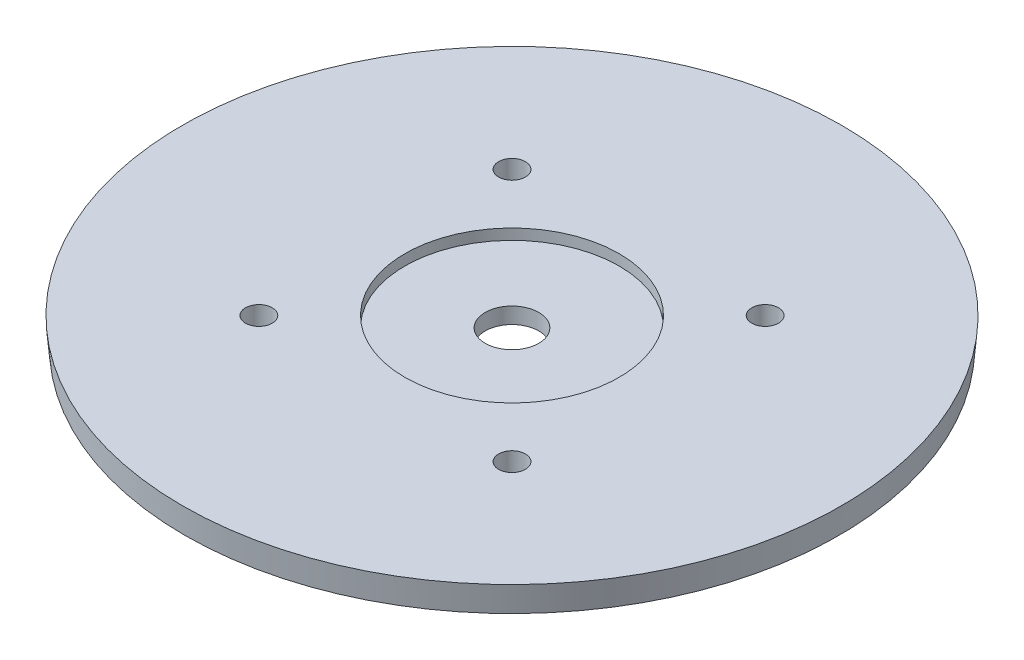
ISO-10303-21;
HEADER;
FILE_DESCRIPTION(('STEP AP214'),'2;1');
FILE_NAME('part.step','',(''),(''),'','','');
FILE_SCHEMA(('AUTOMOTIVE_DESIGN { 1 0 10303 214 1 1 1 1 }'));
ENDSEC;
DATA;
#1=APPLICATION_CONTEXT('core data for automotive mechanical design processes');
#2=APPLICATION_PROTOCOL_DEFINITION('international standard','automotive_design',2000,#1);
#3=PRODUCT_CONTEXT('',#1,'mechanical');
#4=PRODUCT('Part','Part','',(#3));
#5=PRODUCT_RELATED_PRODUCT_CATEGORY('part','',(#4));
#6=PRODUCT_DEFINITION_FORMATION('','',#4);
#7=PRODUCT_DEFINITION_CONTEXT('part definition',#1,'design');
#8=PRODUCT_DEFINITION('design','',#6,#7);
#9=PRODUCT_DEFINITION_SHAPE('','',#8);
#10=(LENGTH_UNIT() NAMED_UNIT(*) SI_UNIT(.MILLI.,.METRE.));
#11=(NAMED_UNIT(*) PLANE_ANGLE_UNIT() SI_UNIT($,.RADIAN.));
#12=(NAMED_UNIT(*) SI_UNIT($,.STERADIAN.) SOLID_ANGLE_UNIT());
#13=UNCERTAINTY_MEASURE_WITH_UNIT(LENGTH_MEASURE(1.E-05),#10,'distance_accuracy_value','');
#14=(GEOMETRIC_REPRESENTATION_CONTEXT(3) GLOBAL_UNCERTAINTY_ASSIGNED_CONTEXT((#13)) GLOBAL_UNIT_ASSIGNED_CONTEXT((#10,
#11,#12)) REPRESENTATION_CONTEXT('',''));
#15=CARTESIAN_POINT('',(0.,0.,0.));
#16=DIRECTION('',(0.,0.,1.));
#17=DIRECTION('',(1.,0.,0.));
#18=AXIS2_PLACEMENT_3D('',#15,#16,#17);
#19=CARTESIAN_POINT('',(0.,-5.,0.));
#20=DIRECTION('',(0.,1.,0.));
#21=DIRECTION('',(0.,0.,1.));
#22=AXIS2_PLACEMENT_3D('',#19,#20,#21);
#23=CYLINDRICAL_SURFACE('',#22,5.);
#24=CARTESIAN_POINT('',(0.,-5.,0.));
#25=DIRECTION('',(0.,1.,0.));
#26=DIRECTION('',(0.,0.,1.));
#27=AXIS2_PLACEMENT_3D('',#24,#25,#26);
#28=CIRCLE('',#27,5.);
#29=CARTESIAN_POINT('',(0.,-5.,4.99999999999999));
#30=VERTEX_POINT('',#29);
#31=EDGE_CURVE('E62',#30,#30,#28,.T.);
#32=ORIENTED_EDGE('',*,*,#31,.F.);
#33=EDGE_LOOP('',(#32));
#34=FACE_BOUND('',#33,.T.);
#35=CARTESIAN_POINT('',(0.,-2.,0.));
#36=DIRECTION('',(0.,1.,0.));
#37=DIRECTION('',(0.,0.,1.));
#38=AXIS2_PLACEMENT_3D('',#35,#36,#37);
#39=CIRCLE('',#38,5.);
#40=CARTESIAN_POINT('',(0.,-2.,4.99999999999999));
#41=VERTEX_POINT('',#40);
#42=EDGE_CURVE('E41',#41,#41,#39,.F.);
#43=ORIENTED_EDGE('',*,*,#42,.F.);
#44=EDGE_LOOP('',(#43));
#45=FACE_BOUND('',#44,.T.);
#46=ADVANCED_FACE('F37',(#34,#45),#23,.F.);
#47=CARTESIAN_POINT('',(0.,0.,0.));
#48=DIRECTION('',(0.,1.,0.));
#49=DIRECTION('',(0.,0.,1.));
#50=AXIS2_PLACEMENT_3D('',#47,#48,#49);
#51=CONICAL_SURFACE('',#50,61.5,0.0872664625997165);
#52=CARTESIAN_POINT('',(0.,-5.,0.));
#53=DIRECTION('',(0.,1.,0.));
#54=DIRECTION('',(0.,0.,1.));
#55=AXIS2_PLACEMENT_3D('',#52,#53,#54);
#56=CIRCLE('',#55,61.0625566823704);
#57=CARTESIAN_POINT('',(0.,-5.,61.0625566823704));
#58=VERTEX_POINT('',#57);
#59=EDGE_CURVE('E10',#58,#58,#56,.T.);
#60=ORIENTED_EDGE('',*,*,#59,.T.);
#61=EDGE_LOOP('',(#60));
#62=FACE_BOUND('',#61,.T.);
#63=CARTESIAN_POINT('',(0.,0.,0.));
#64=DIRECTION('',(0.,1.,0.));
#65=DIRECTION('',(0.,0.,1.));
#66=AXIS2_PLACEMENT_3D('',#63,#64,#65);
#67=CIRCLE('',#66,61.5);
#68=CARTESIAN_POINT('',(0.,0.,61.5));
#69=VERTEX_POINT('',#68);
#70=EDGE_CURVE('E46',#69,#69,#67,.T.);
#71=ORIENTED_EDGE('',*,*,#70,.F.);
#72=EDGE_LOOP('',(#71));
#73=FACE_BOUND('',#72,.T.);
#74=ADVANCED_FACE('F39',(#62,#73),#51,.T.);
#75=CARTESIAN_POINT('',(0.,-5.,0.));
#76=DIRECTION('',(0.,1.,0.));
#77=DIRECTION('',(0.,0.,1.));
#78=AXIS2_PLACEMENT_3D('',#75,#76,#77);
#79=PLANE('',#78);
#80=ORIENTED_EDGE('',*,*,#31,.T.);
#81=EDGE_LOOP('',(#80));
#82=FACE_BOUND('',#81,.T.);
#83=CARTESIAN_POINT('',(-23.62,-5.,-23.62));
#84=DIRECTION('',(0.,1.,0.));
#85=DIRECTION('',(0.,0.,1.));
#86=AXIS2_PLACEMENT_3D('',#83,#84,#85);
#87=CIRCLE('',#86,2.5);
#88=CARTESIAN_POINT('',(-23.62,-5.,-21.12));
#89=VERTEX_POINT('',#88);
#90=EDGE_CURVE('E70',#89,#89,#87,.T.);
#91=ORIENTED_EDGE('',*,*,#90,.T.);
#92=EDGE_LOOP('',(#91));
#93=FACE_BOUND('',#92,.T.);
#94=CARTESIAN_POINT('',(-23.62,-5.,23.62));
#95=DIRECTION('',(0.,1.,0.));
#96=DIRECTION('',(0.,0.,1.));
#97=AXIS2_PLACEMENT_3D('',#94,#95,#96);
#98=CIRCLE('',#97,2.5);
#99=CARTESIAN_POINT('',(-23.62,-5.,26.12));
#100=VERTEX_POINT('',#99);
#101=EDGE_CURVE('E78',#100,#100,#98,.T.);
#102=ORIENTED_EDGE('',*,*,#101,.T.);
#103=EDGE_LOOP('',(#102));
#104=FACE_BOUND('',#103,.T.);
#105=CARTESIAN_POINT('',(23.62,-5.,23.62));
#106=DIRECTION('',(0.,1.,0.));
#107=DIRECTION('',(0.,0.,1.));
#108=AXIS2_PLACEMENT_3D('',#105,#106,#107);
#109=CIRCLE('',#108,2.5);
#110=CARTESIAN_POINT('',(23.62,-5.,26.12));
#111=VERTEX_POINT('',#110);
#112=EDGE_CURVE('E58',#111,#111,#109,.T.);
#113=ORIENTED_EDGE('',*,*,#112,.T.);
#114=EDGE_LOOP('',(#113));
#115=FACE_BOUND('',#114,.T.);
#116=CARTESIAN_POINT('',(23.62,-5.,-23.62));
#117=DIRECTION('',(0.,1.,0.));
#118=DIRECTION('',(0.,0.,1.));
#119=AXIS2_PLACEMENT_3D('',#116,#117,#118);
#120=CIRCLE('',#119,2.5);
#121=CARTESIAN_POINT('',(23.62,-5.,-21.12));
#122=VERTEX_POINT('',#121);
#123=EDGE_CURVE('E51',#122,#122,#120,.T.);
#124=ORIENTED_EDGE('',*,*,#123,.T.);
#125=EDGE_LOOP('',(#124));
#126=FACE_BOUND('',#125,.T.);
#127=ORIENTED_EDGE('',*,*,#59,.F.);
#128=EDGE_LOOP('',(#127));
#129=FACE_BOUND('',#128,.T.);
#130=ADVANCED_FACE('F110',(#82,#93,#104,#115,#126,#129),#79,.F.);
#131=CARTESIAN_POINT('',(0.,0.,0.));
#132=DIRECTION('',(0.,1.,0.));
#133=DIRECTION('',(0.,0.,1.));
#134=AXIS2_PLACEMENT_3D('',#131,#132,#133);
#135=PLANE('',#134);
#136=CARTESIAN_POINT('',(0.,0.,0.));
#137=DIRECTION('',(0.,1.,0.));
#138=DIRECTION('',(0.,0.,1.));
#139=AXIS2_PLACEMENT_3D('',#136,#137,#138);
#140=CIRCLE('',#139,20.);
#141=CARTESIAN_POINT('',(0.,0.,20.));
#142=VERTEX_POINT('',#141);
#143=EDGE_CURVE('E89',#142,#142,#140,.T.);
#144=ORIENTED_EDGE('',*,*,#143,.F.);
#145=EDGE_LOOP('',(#144));
#146=FACE_BOUND('',#145,.T.);
#147=CARTESIAN_POINT('',(-23.62,0.,-23.62));
#148=DIRECTION('',(0.,1.,0.));
#149=DIRECTION('',(0.,0.,1.));
#150=AXIS2_PLACEMENT_3D('',#147,#148,#149);
#151=CIRCLE('',#150,2.5);
#152=CARTESIAN_POINT('',(-23.62,0.,-21.12));
#153=VERTEX_POINT('',#152);
#154=EDGE_CURVE('E66',#153,#153,#151,.T.);
#155=ORIENTED_EDGE('',*,*,#154,.F.);
#156=EDGE_LOOP('',(#155));
#157=FACE_BOUND('',#156,.T.);
#158=CARTESIAN_POINT('',(-23.62,0.,23.62));
#159=DIRECTION('',(0.,1.,0.));
#160=DIRECTION('',(0.,0.,1.));
#161=AXIS2_PLACEMENT_3D('',#158,#159,#160);
#162=CIRCLE('',#161,2.5);
#163=CARTESIAN_POINT('',(-23.62,0.,26.12));
#164=VERTEX_POINT('',#163);
#165=EDGE_CURVE('E74',#164,#164,#162,.T.);
#166=ORIENTED_EDGE('',*,*,#165,.F.);
#167=EDGE_LOOP('',(#166));
#168=FACE_BOUND('',#167,.T.);
#169=CARTESIAN_POINT('',(23.62,0.,23.62));
#170=DIRECTION('',(0.,1.,0.));
#171=DIRECTION('',(0.,0.,1.));
#172=AXIS2_PLACEMENT_3D('',#169,#170,#171);
#173=CIRCLE('',#172,2.5);
#174=CARTESIAN_POINT('',(23.62,0.,26.12));
#175=VERTEX_POINT('',#174);
#176=EDGE_CURVE('E82',#175,#175,#173,.T.);
#177=ORIENTED_EDGE('',*,*,#176,.F.);
#178=EDGE_LOOP('',(#177));
#179=FACE_BOUND('',#178,.T.);
#180=CARTESIAN_POINT('',(23.62,0.,-23.62));
#181=DIRECTION('',(0.,1.,0.));
#182=DIRECTION('',(0.,0.,1.));
#183=AXIS2_PLACEMENT_3D('',#180,#181,#182);
#184=CIRCLE('',#183,2.5);
#185=CARTESIAN_POINT('',(23.62,0.,-21.12));
#186=VERTEX_POINT('',#185);
#187=EDGE_CURVE('E54',#186,#186,#184,.T.);
#188=ORIENTED_EDGE('',*,*,#187,.F.);
#189=EDGE_LOOP('',(#188));
#190=FACE_BOUND('',#189,.T.);
#191=ORIENTED_EDGE('',*,*,#70,.T.);
#192=EDGE_LOOP('',(#191));
#193=FACE_BOUND('',#192,.T.);
#194=ADVANCED_FACE('F120',(#146,#157,#168,#179,#190,#193),#135,.T.);
#195=CARTESIAN_POINT('',(23.62,-5.,-23.62));
#196=DIRECTION('',(0.,1.,0.));
#197=DIRECTION('',(0.,0.,1.));
#198=AXIS2_PLACEMENT_3D('',#195,#196,#197);
#199=CYLINDRICAL_SURFACE('',#198,2.5);
#200=ORIENTED_EDGE('',*,*,#123,.F.);
#201=EDGE_LOOP('',(#200));
#202=FACE_BOUND('',#201,.T.);
#203=ORIENTED_EDGE('',*,*,#187,.T.);
#204=EDGE_LOOP('',(#203));
#205=FACE_BOUND('',#204,.T.);
#206=ADVANCED_FACE('F116',(#202,#205),#199,.F.);
#207=CARTESIAN_POINT('',(23.62,-5.,23.62));
#208=DIRECTION('',(0.,1.,0.));
#209=DIRECTION('',(0.,0.,1.));
#210=AXIS2_PLACEMENT_3D('',#207,#208,#209);
#211=CYLINDRICAL_SURFACE('',#210,2.5);
#212=ORIENTED_EDGE('',*,*,#112,.F.);
#213=EDGE_LOOP('',(#212));
#214=FACE_BOUND('',#213,.T.);
#215=ORIENTED_EDGE('',*,*,#176,.T.);
#216=EDGE_LOOP('',(#215));
#217=FACE_BOUND('',#216,.T.);
#218=ADVANCED_FACE('F119',(#214,#217),#211,.F.);
#219=CARTESIAN_POINT('',(-23.62,-5.,23.62));
#220=DIRECTION('',(0.,1.,0.));
#221=DIRECTION('',(0.,0.,1.));
#222=AXIS2_PLACEMENT_3D('',#219,#220,#221);
#223=CYLINDRICAL_SURFACE('',#222,2.5);
#224=ORIENTED_EDGE('',*,*,#101,.F.);
#225=EDGE_LOOP('',(#224));
#226=FACE_BOUND('',#225,.T.);
#227=ORIENTED_EDGE('',*,*,#165,.T.);
#228=EDGE_LOOP('',(#227));
#229=FACE_BOUND('',#228,.T.);
#230=ADVANCED_FACE('F143',(#226,#229),#223,.F.);
#231=CARTESIAN_POINT('',(-23.62,-5.,-23.62));
#232=DIRECTION('',(0.,1.,0.));
#233=DIRECTION('',(0.,0.,1.));
#234=AXIS2_PLACEMENT_3D('',#231,#232,#233);
#235=CYLINDRICAL_SURFACE('',#234,2.5);
#236=ORIENTED_EDGE('',*,*,#90,.F.);
#237=EDGE_LOOP('',(#236));
#238=FACE_BOUND('',#237,.T.);
#239=ORIENTED_EDGE('',*,*,#154,.T.);
#240=EDGE_LOOP('',(#239));
#241=FACE_BOUND('',#240,.T.);
#242=ADVANCED_FACE('F114',(#238,#241),#235,.F.);
#243=CARTESIAN_POINT('',(0.,-2.,0.));
#244=DIRECTION('',(0.,1.,0.));
#245=DIRECTION('',(0.,0.,1.));
#246=AXIS2_PLACEMENT_3D('',#243,#244,#245);
#247=PLANE('',#246);
#248=CARTESIAN_POINT('',(0.,-2.,0.));
#249=DIRECTION('',(0.,1.,0.));
#250=DIRECTION('',(0.,0.,1.));
#251=AXIS2_PLACEMENT_3D('',#248,#249,#250);
#252=CIRCLE('',#251,20.);
#253=CARTESIAN_POINT('',(0.,-2.,20.));
#254=VERTEX_POINT('',#253);
#255=EDGE_CURVE('E93',#254,#254,#252,.T.);
#256=ORIENTED_EDGE('',*,*,#255,.T.);
#257=EDGE_LOOP('',(#256));
#258=FACE_BOUND('',#257,.T.);
#259=ORIENTED_EDGE('',*,*,#42,.T.);
#260=EDGE_LOOP('',(#259));
#261=FACE_BOUND('',#260,.T.);
#262=ADVANCED_FACE('F102',(#258,#261),#247,.T.);
#263=CARTESIAN_POINT('',(0.,-2.,0.));
#264=DIRECTION('',(0.,1.,0.));
#265=DIRECTION('',(0.,0.,1.));
#266=AXIS2_PLACEMENT_3D('',#263,#264,#265);
#267=CYLINDRICAL_SURFACE('',#266,20.);
#268=ORIENTED_EDGE('',*,*,#255,.F.);
#269=EDGE_LOOP('',(#268));
#270=FACE_BOUND('',#269,.T.);
#271=ORIENTED_EDGE('',*,*,#143,.T.);
#272=EDGE_LOOP('',(#271));
#273=FACE_BOUND('',#272,.T.);
#274=ADVANCED_FACE('F152',(#270,#273),#267,.F.);
#275=CLOSED_SHELL('',(#46,#74,#130,#194,#206,#218,#230,#242,#262,#274));
#276=MANIFOLD_SOLID_BREP('B2',#275);
#277=ADVANCED_BREP_SHAPE_REPRESENTATION('',(#18,#276),#14);
#278=SHAPE_DEFINITION_REPRESENTATION(#9,#277);
ENDSEC;
END-ISO-10303-21;
